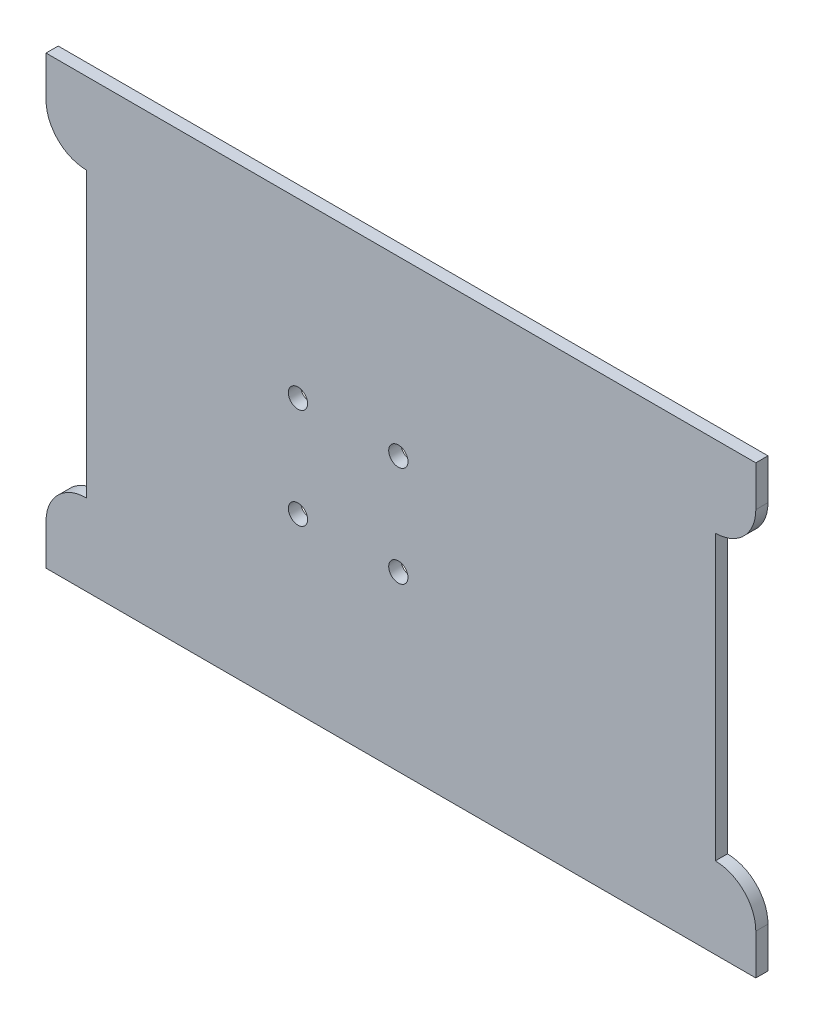
ISO-10303-21;
HEADER;
FILE_DESCRIPTION(('STEP AP214'),'2;1');
FILE_NAME('part.step','',(''),(''),'','','');
FILE_SCHEMA(('AUTOMOTIVE_DESIGN { 1 0 10303 214 1 1 1 1 }'));
ENDSEC;
DATA;
#1=APPLICATION_CONTEXT('core data for automotive mechanical design processes');
#2=APPLICATION_PROTOCOL_DEFINITION('international standard','automotive_design',2000,#1);
#3=PRODUCT_CONTEXT('',#1,'mechanical');
#4=PRODUCT('Part','Part','',(#3));
#5=PRODUCT_RELATED_PRODUCT_CATEGORY('part','',(#4));
#6=PRODUCT_DEFINITION_FORMATION('','',#4);
#7=PRODUCT_DEFINITION_CONTEXT('part definition',#1,'design');
#8=PRODUCT_DEFINITION('design','',#6,#7);
#9=PRODUCT_DEFINITION_SHAPE('','',#8);
#10=(LENGTH_UNIT() NAMED_UNIT(*) SI_UNIT(.MILLI.,.METRE.));
#11=(NAMED_UNIT(*) PLANE_ANGLE_UNIT() SI_UNIT($,.RADIAN.));
#12=(NAMED_UNIT(*) SI_UNIT($,.STERADIAN.) SOLID_ANGLE_UNIT());
#13=UNCERTAINTY_MEASURE_WITH_UNIT(LENGTH_MEASURE(1.E-05),#10,'distance_accuracy_value','');
#14=(GEOMETRIC_REPRESENTATION_CONTEXT(3) GLOBAL_UNCERTAINTY_ASSIGNED_CONTEXT((#13)) GLOBAL_UNIT_ASSIGNED_CONTEXT((#10,
#11,#12)) REPRESENTATION_CONTEXT('',''));
#15=CARTESIAN_POINT('',(0.,0.,0.));
#16=DIRECTION('',(0.,0.,1.));
#17=DIRECTION('',(1.,0.,0.));
#18=AXIS2_PLACEMENT_3D('',#15,#16,#17);
#19=CARTESIAN_POINT('',(0.,0.,-1.2));
#20=DIRECTION('',(0.,0.,1.));
#21=DIRECTION('',(1.,0.,0.));
#22=AXIS2_PLACEMENT_3D('',#19,#20,#21);
#23=PLANE('',#22);
#24=CARTESIAN_POINT('',(-10.153838394039,-4.94974746830586,-1.2));
#25=DIRECTION('',(0.,0.,1.));
#26=DIRECTION('',(1.,0.,0.));
#27=AXIS2_PLACEMENT_3D('',#24,#25,#26);
#28=CIRCLE('',#27,0.950000000000003);
#29=CARTESIAN_POINT('',(-9.20383839403895,-4.94974746830586,-1.2));
#30=VERTEX_POINT('',#29);
#31=EDGE_CURVE('E263',#30,#30,#28,.T.);
#32=ORIENTED_EDGE('',*,*,#31,.T.);
#33=EDGE_LOOP('',(#32));
#34=FACE_BOUND('',#33,.T.);
#35=CARTESIAN_POINT('',(-0.254343457427289,-4.9497474683058,-1.2));
#36=DIRECTION('',(0.,0.,1.));
#37=DIRECTION('',(1.,0.,0.));
#38=AXIS2_PLACEMENT_3D('',#35,#36,#37);
#39=CIRCLE('',#38,0.950000000000001);
#40=CARTESIAN_POINT('',(0.695656542572711,-4.9497474683058,-1.2));
#41=VERTEX_POINT('',#40);
#42=EDGE_CURVE('E257',#41,#41,#39,.T.);
#43=ORIENTED_EDGE('',*,*,#42,.T.);
#44=EDGE_LOOP('',(#43));
#45=FACE_BOUND('',#44,.T.);
#46=CARTESIAN_POINT('',(-0.254343457427348,4.94974746830586,-1.2));
#47=DIRECTION('',(0.,0.,1.));
#48=DIRECTION('',(1.,0.,0.));
#49=AXIS2_PLACEMENT_3D('',#46,#47,#48);
#50=CIRCLE('',#49,0.95);
#51=CARTESIAN_POINT('',(0.695656542572652,4.94974746830586,-1.2));
#52=VERTEX_POINT('',#51);
#53=EDGE_CURVE('E251',#52,#52,#50,.T.);
#54=ORIENTED_EDGE('',*,*,#53,.T.);
#55=EDGE_LOOP('',(#54));
#56=FACE_BOUND('',#55,.T.);
#57=CARTESIAN_POINT('',(-10.153838394039,4.9497474683058,-1.2));
#58=DIRECTION('',(0.,0.,1.));
#59=DIRECTION('',(1.,0.,0.));
#60=AXIS2_PLACEMENT_3D('',#57,#58,#59);
#61=CIRCLE('',#60,0.950000000000003);
#62=CARTESIAN_POINT('',(-9.20383839403901,4.9497474683058,-1.2));
#63=VERTEX_POINT('',#62);
#64=EDGE_CURVE('E245',#63,#63,#61,.T.);
#65=ORIENTED_EDGE('',*,*,#64,.T.);
#66=EDGE_LOOP('',(#65));
#67=FACE_BOUND('',#66,.T.);
#68=CARTESIAN_POINT('',(31.,-18.,-1.2));
#69=DIRECTION('',(0.,0.,-1.));
#70=DIRECTION('',(-1.,0.,0.));
#71=AXIS2_PLACEMENT_3D('',#68,#69,#70);
#72=CIRCLE('',#71,4.);
#73=CARTESIAN_POINT('',(31.,-14.,-1.2));
#74=VERTEX_POINT('',#73);
#75=CARTESIAN_POINT('',(35.,-18.,-1.2));
#76=VERTEX_POINT('',#75);
#77=EDGE_CURVE('E130',#74,#76,#72,.T.);
#78=ORIENTED_EDGE('',*,*,#77,.T.);
#79=DIRECTION('',(0.,1.,0.));
#80=VECTOR('',#79,1.);
#81=CARTESIAN_POINT('',(35.,-22.,-1.2));
#82=LINE('',#81,#80);
#83=CARTESIAN_POINT('',(35.,-22.,-1.2));
#84=VERTEX_POINT('',#83);
#85=EDGE_CURVE('E145',#84,#76,#82,.T.);
#86=ORIENTED_EDGE('',*,*,#85,.F.);
#87=DIRECTION('',(1.,0.,0.));
#88=VECTOR('',#87,1.);
#89=CARTESIAN_POINT('',(35.,-22.,-1.2));
#90=LINE('',#89,#88);
#91=CARTESIAN_POINT('',(-35.,-22.,-1.2));
#92=VERTEX_POINT('',#91);
#93=EDGE_CURVE('E156',#92,#84,#90,.T.);
#94=ORIENTED_EDGE('',*,*,#93,.F.);
#95=DIRECTION('',(0.,-1.,0.));
#96=VECTOR('',#95,1.);
#97=CARTESIAN_POINT('',(-35.,-22.,-1.2));
#98=LINE('',#97,#96);
#99=CARTESIAN_POINT('',(-35.,-18.,-1.2));
#100=VERTEX_POINT('',#99);
#101=EDGE_CURVE('E172',#100,#92,#98,.T.);
#102=ORIENTED_EDGE('',*,*,#101,.F.);
#103=CARTESIAN_POINT('',(-31.,-18.,-1.2));
#104=DIRECTION('',(0.,0.,-1.));
#105=DIRECTION('',(-1.,0.,0.));
#106=AXIS2_PLACEMENT_3D('',#103,#104,#105);
#107=CIRCLE('',#106,4.);
#108=CARTESIAN_POINT('',(-31.,-14.,-1.2));
#109=VERTEX_POINT('',#108);
#110=EDGE_CURVE('E199',#100,#109,#107,.T.);
#111=ORIENTED_EDGE('',*,*,#110,.T.);
#112=DIRECTION('',(0.,1.,0.));
#113=VECTOR('',#112,1.);
#114=CARTESIAN_POINT('',(-31.,0.,-1.2));
#115=LINE('',#114,#113);
#116=CARTESIAN_POINT('',(-31.,14.,-1.2));
#117=VERTEX_POINT('',#116);
#118=EDGE_CURVE('E206',#109,#117,#115,.T.);
#119=ORIENTED_EDGE('',*,*,#118,.T.);
#120=CARTESIAN_POINT('',(-31.,18.,-1.2));
#121=DIRECTION('',(0.,0.,-1.));
#122=DIRECTION('',(-1.,0.,0.));
#123=AXIS2_PLACEMENT_3D('',#120,#121,#122);
#124=CIRCLE('',#123,4.);
#125=CARTESIAN_POINT('',(-35.,18.,-1.2));
#126=VERTEX_POINT('',#125);
#127=EDGE_CURVE('E209',#117,#126,#124,.T.);
#128=ORIENTED_EDGE('',*,*,#127,.T.);
#129=CARTESIAN_POINT('',(-35.,22.,-1.2));
#130=VERTEX_POINT('',#129);
#131=EDGE_CURVE('E200',#130,#126,#98,.T.);
#132=ORIENTED_EDGE('',*,*,#131,.F.);
#133=DIRECTION('',(-1.,0.,0.));
#134=VECTOR('',#133,1.);
#135=CARTESIAN_POINT('',(35.,22.,-1.2));
#136=LINE('',#135,#134);
#137=CARTESIAN_POINT('',(35.,22.,-1.2));
#138=VERTEX_POINT('',#137);
#139=EDGE_CURVE('E151',#138,#130,#136,.T.);
#140=ORIENTED_EDGE('',*,*,#139,.F.);
#141=CARTESIAN_POINT('',(35.,18.,-1.2));
#142=VERTEX_POINT('',#141);
#143=EDGE_CURVE('E152',#142,#138,#82,.T.);
#144=ORIENTED_EDGE('',*,*,#143,.F.);
#145=CARTESIAN_POINT('',(31.,18.,-1.2));
#146=DIRECTION('',(0.,0.,-1.));
#147=DIRECTION('',(-1.,0.,0.));
#148=AXIS2_PLACEMENT_3D('',#145,#146,#147);
#149=CIRCLE('',#148,4.);
#150=CARTESIAN_POINT('',(31.,14.,-1.2));
#151=VERTEX_POINT('',#150);
#152=EDGE_CURVE('E53',#142,#151,#149,.T.);
#153=ORIENTED_EDGE('',*,*,#152,.T.);
#154=DIRECTION('',(0.,1.,0.));
#155=VECTOR('',#154,1.);
#156=CARTESIAN_POINT('',(31.,0.,-1.2));
#157=LINE('',#156,#155);
#158=EDGE_CURVE('E147',#151,#74,#157,.F.);
#159=ORIENTED_EDGE('',*,*,#158,.T.);
#160=EDGE_LOOP('',(#78,#86,#94,#102,#111,#119,#128,#132,#140,#144,#153,#159));
#161=FACE_BOUND('',#160,.T.);
#162=ADVANCED_FACE('F36',(#34,#45,#56,#67,#161),#23,.F.);
#163=CARTESIAN_POINT('',(0.,0.,0.));
#164=DIRECTION('',(0.,0.,1.));
#165=DIRECTION('',(1.,0.,0.));
#166=AXIS2_PLACEMENT_3D('',#163,#164,#165);
#167=PLANE('',#166);
#168=CARTESIAN_POINT('',(-10.153838394039,-4.94974746830586,0.));
#169=DIRECTION('',(0.,0.,1.));
#170=DIRECTION('',(1.,0.,0.));
#171=AXIS2_PLACEMENT_3D('',#168,#169,#170);
#172=CIRCLE('',#171,0.950000000000003);
#173=CARTESIAN_POINT('',(-9.20383839403895,-4.94974746830586,0.));
#174=VERTEX_POINT('',#173);
#175=EDGE_CURVE('E266',#174,#174,#172,.T.);
#176=ORIENTED_EDGE('',*,*,#175,.F.);
#177=EDGE_LOOP('',(#176));
#178=FACE_BOUND('',#177,.T.);
#179=CARTESIAN_POINT('',(-0.254343457427289,-4.9497474683058,0.));
#180=DIRECTION('',(0.,0.,1.));
#181=DIRECTION('',(1.,0.,0.));
#182=AXIS2_PLACEMENT_3D('',#179,#180,#181);
#183=CIRCLE('',#182,0.950000000000001);
#184=CARTESIAN_POINT('',(0.695656542572711,-4.9497474683058,0.));
#185=VERTEX_POINT('',#184);
#186=EDGE_CURVE('E260',#185,#185,#183,.T.);
#187=ORIENTED_EDGE('',*,*,#186,.F.);
#188=EDGE_LOOP('',(#187));
#189=FACE_BOUND('',#188,.T.);
#190=CARTESIAN_POINT('',(-0.254343457427348,4.94974746830586,0.));
#191=DIRECTION('',(0.,0.,1.));
#192=DIRECTION('',(1.,0.,0.));
#193=AXIS2_PLACEMENT_3D('',#190,#191,#192);
#194=CIRCLE('',#193,0.95);
#195=CARTESIAN_POINT('',(0.695656542572652,4.94974746830586,0.));
#196=VERTEX_POINT('',#195);
#197=EDGE_CURVE('E254',#196,#196,#194,.T.);
#198=ORIENTED_EDGE('',*,*,#197,.F.);
#199=EDGE_LOOP('',(#198));
#200=FACE_BOUND('',#199,.T.);
#201=CARTESIAN_POINT('',(-10.153838394039,4.9497474683058,0.));
#202=DIRECTION('',(0.,0.,1.));
#203=DIRECTION('',(1.,0.,0.));
#204=AXIS2_PLACEMENT_3D('',#201,#202,#203);
#205=CIRCLE('',#204,0.950000000000003);
#206=CARTESIAN_POINT('',(-9.20383839403901,4.9497474683058,0.));
#207=VERTEX_POINT('',#206);
#208=EDGE_CURVE('E248',#207,#207,#205,.T.);
#209=ORIENTED_EDGE('',*,*,#208,.F.);
#210=EDGE_LOOP('',(#209));
#211=FACE_BOUND('',#210,.T.);
#212=DIRECTION('',(0.,1.,0.));
#213=VECTOR('',#212,1.);
#214=CARTESIAN_POINT('',(35.,-22.,0.));
#215=LINE('',#214,#213);
#216=CARTESIAN_POINT('',(35.,-22.,0.));
#217=VERTEX_POINT('',#216);
#218=CARTESIAN_POINT('',(35.,-18.,0.));
#219=VERTEX_POINT('',#218);
#220=EDGE_CURVE('E168',#217,#219,#215,.T.);
#221=ORIENTED_EDGE('',*,*,#220,.T.);
#222=CARTESIAN_POINT('',(31.,-18.,0.));
#223=DIRECTION('',(0.,0.,-1.));
#224=DIRECTION('',(-1.,0.,0.));
#225=AXIS2_PLACEMENT_3D('',#222,#223,#224);
#226=CIRCLE('',#225,4.);
#227=CARTESIAN_POINT('',(31.,-14.,0.));
#228=VERTEX_POINT('',#227);
#229=EDGE_CURVE('E133',#228,#219,#226,.T.);
#230=ORIENTED_EDGE('',*,*,#229,.F.);
#231=DIRECTION('',(0.,-1.,0.));
#232=VECTOR('',#231,1.);
#233=CARTESIAN_POINT('',(31.,-14.,0.));
#234=LINE('',#233,#232);
#235=CARTESIAN_POINT('',(31.,14.,0.));
#236=VERTEX_POINT('',#235);
#237=EDGE_CURVE('E241',#236,#228,#234,.T.);
#238=ORIENTED_EDGE('',*,*,#237,.F.);
#239=CARTESIAN_POINT('',(31.,18.,0.));
#240=DIRECTION('',(0.,0.,-1.));
#241=DIRECTION('',(1.,0.,0.));
#242=AXIS2_PLACEMENT_3D('',#239,#240,#241);
#243=CIRCLE('',#242,4.);
#244=CARTESIAN_POINT('',(35.,18.,0.));
#245=VERTEX_POINT('',#244);
#246=EDGE_CURVE('E243',#245,#236,#243,.T.);
#247=ORIENTED_EDGE('',*,*,#246,.F.);
#248=CARTESIAN_POINT('',(35.,22.,0.));
#249=VERTEX_POINT('',#248);
#250=EDGE_CURVE('E167',#245,#249,#215,.T.);
#251=ORIENTED_EDGE('',*,*,#250,.T.);
#252=DIRECTION('',(-1.,0.,0.));
#253=VECTOR('',#252,1.);
#254=CARTESIAN_POINT('',(35.,22.,0.));
#255=LINE('',#254,#253);
#256=CARTESIAN_POINT('',(-35.,22.,0.));
#257=VERTEX_POINT('',#256);
#258=EDGE_CURVE('E170',#249,#257,#255,.T.);
#259=ORIENTED_EDGE('',*,*,#258,.T.);
#260=DIRECTION('',(0.,-1.,0.));
#261=VECTOR('',#260,1.);
#262=CARTESIAN_POINT('',(-35.,-22.,0.));
#263=LINE('',#262,#261);
#264=CARTESIAN_POINT('',(-35.,18.,0.));
#265=VERTEX_POINT('',#264);
#266=EDGE_CURVE('E160',#257,#265,#263,.T.);
#267=ORIENTED_EDGE('',*,*,#266,.T.);
#268=CARTESIAN_POINT('',(-31.,18.,0.));
#269=DIRECTION('',(0.,0.,-1.));
#270=DIRECTION('',(-1.,0.,0.));
#271=AXIS2_PLACEMENT_3D('',#268,#269,#270);
#272=CIRCLE('',#271,4.);
#273=CARTESIAN_POINT('',(-31.,14.,0.));
#274=VERTEX_POINT('',#273);
#275=EDGE_CURVE('E217',#274,#265,#272,.T.);
#276=ORIENTED_EDGE('',*,*,#275,.F.);
#277=DIRECTION('',(0.,1.,0.));
#278=VECTOR('',#277,1.);
#279=CARTESIAN_POINT('',(-31.,-14.,0.));
#280=LINE('',#279,#278);
#281=CARTESIAN_POINT('',(-31.,-14.,0.));
#282=VERTEX_POINT('',#281);
#283=EDGE_CURVE('E215',#282,#274,#280,.T.);
#284=ORIENTED_EDGE('',*,*,#283,.F.);
#285=CARTESIAN_POINT('',(-31.,-18.,0.));
#286=DIRECTION('',(0.,0.,-1.));
#287=DIRECTION('',(1.,0.,0.));
#288=AXIS2_PLACEMENT_3D('',#285,#286,#287);
#289=CIRCLE('',#288,4.);
#290=CARTESIAN_POINT('',(-35.,-18.,0.));
#291=VERTEX_POINT('',#290);
#292=EDGE_CURVE('E189',#291,#282,#289,.T.);
#293=ORIENTED_EDGE('',*,*,#292,.F.);
#294=CARTESIAN_POINT('',(-35.,-22.,0.));
#295=VERTEX_POINT('',#294);
#296=EDGE_CURVE('E164',#291,#295,#263,.T.);
#297=ORIENTED_EDGE('',*,*,#296,.T.);
#298=DIRECTION('',(1.,0.,0.));
#299=VECTOR('',#298,1.);
#300=CARTESIAN_POINT('',(35.,-22.,0.));
#301=LINE('',#300,#299);
#302=EDGE_CURVE('E163',#295,#217,#301,.T.);
#303=ORIENTED_EDGE('',*,*,#302,.T.);
#304=EDGE_LOOP('',(#221,#230,#238,#247,#251,#259,#267,#276,#284,#293,#297,#303));
#305=FACE_BOUND('',#304,.T.);
#306=ADVANCED_FACE('F186',(#178,#189,#200,#211,#305),#167,.T.);
#307=CARTESIAN_POINT('',(35.,-22.,-1.2));
#308=DIRECTION('',(1.,0.,0.));
#309=DIRECTION('',(0.,0.,-1.));
#310=AXIS2_PLACEMENT_3D('',#307,#308,#309);
#311=PLANE('',#310);
#312=ORIENTED_EDGE('',*,*,#250,.F.);
#313=DIRECTION('',(0.,0.,1.));
#314=VECTOR('',#313,1.);
#315=CARTESIAN_POINT('',(35.,18.,0.));
#316=LINE('',#315,#314);
#317=EDGE_CURVE('E139',#245,#142,#316,.F.);
#318=ORIENTED_EDGE('',*,*,#317,.T.);
#319=ORIENTED_EDGE('',*,*,#143,.T.);
#320=DIRECTION('',(0.,0.,1.));
#321=VECTOR('',#320,1.);
#322=CARTESIAN_POINT('',(35.,22.,-1.2));
#323=LINE('',#322,#321);
#324=EDGE_CURVE('E45',#138,#249,#323,.T.);
#325=ORIENTED_EDGE('',*,*,#324,.T.);
#326=EDGE_LOOP('',(#312,#318,#319,#325));
#327=FACE_BOUND('',#326,.T.);
#328=ADVANCED_FACE('F236',(#327),#311,.T.);
#329=CARTESIAN_POINT('',(-35.,-22.,-1.2));
#330=DIRECTION('',(-1.,0.,0.));
#331=DIRECTION('',(0.,0.,1.));
#332=AXIS2_PLACEMENT_3D('',#329,#330,#331);
#333=PLANE('',#332);
#334=ORIENTED_EDGE('',*,*,#296,.F.);
#335=DIRECTION('',(0.,0.,1.));
#336=VECTOR('',#335,1.);
#337=CARTESIAN_POINT('',(-35.,-18.,0.));
#338=LINE('',#337,#336);
#339=EDGE_CURVE('E191',#291,#100,#338,.F.);
#340=ORIENTED_EDGE('',*,*,#339,.T.);
#341=ORIENTED_EDGE('',*,*,#101,.T.);
#342=DIRECTION('',(0.,0.,1.));
#343=VECTOR('',#342,1.);
#344=CARTESIAN_POINT('',(-35.,-22.,-1.2));
#345=LINE('',#344,#343);
#346=EDGE_CURVE('E40',#92,#295,#345,.T.);
#347=ORIENTED_EDGE('',*,*,#346,.T.);
#348=EDGE_LOOP('',(#334,#340,#341,#347));
#349=FACE_BOUND('',#348,.T.);
#350=ADVANCED_FACE('F181',(#349),#333,.T.);
#351=DIRECTION('',(0.,0.,1.));
#352=VECTOR('',#351,1.);
#353=CARTESIAN_POINT('',(-35.,18.,0.));
#354=LINE('',#353,#352);
#355=EDGE_CURVE('E190',#265,#126,#354,.F.);
#356=ORIENTED_EDGE('',*,*,#355,.F.);
#357=ORIENTED_EDGE('',*,*,#266,.F.);
#358=DIRECTION('',(0.,0.,1.));
#359=VECTOR('',#358,1.);
#360=CARTESIAN_POINT('',(-35.,22.,-1.2));
#361=LINE('',#360,#359);
#362=EDGE_CURVE('E11',#130,#257,#361,.T.);
#363=ORIENTED_EDGE('',*,*,#362,.F.);
#364=ORIENTED_EDGE('',*,*,#131,.T.);
#365=EDGE_LOOP('',(#356,#357,#363,#364));
#366=FACE_BOUND('',#365,.T.);
#367=ADVANCED_FACE('F38',(#366),#333,.T.);
#368=CARTESIAN_POINT('',(35.,22.,-1.2));
#369=DIRECTION('',(0.,1.,0.));
#370=DIRECTION('',(-1.,0.,0.));
#371=AXIS2_PLACEMENT_3D('',#368,#369,#370);
#372=PLANE('',#371);
#373=ORIENTED_EDGE('',*,*,#258,.F.);
#374=ORIENTED_EDGE('',*,*,#324,.F.);
#375=ORIENTED_EDGE('',*,*,#139,.T.);
#376=ORIENTED_EDGE('',*,*,#362,.T.);
#377=EDGE_LOOP('',(#373,#374,#375,#376));
#378=FACE_BOUND('',#377,.T.);
#379=ADVANCED_FACE('F232',(#378),#372,.T.);
#380=DIRECTION('',(0.,0.,1.));
#381=VECTOR('',#380,1.);
#382=CARTESIAN_POINT('',(35.,-18.,0.));
#383=LINE('',#382,#381);
#384=EDGE_CURVE('E126',#219,#76,#383,.F.);
#385=ORIENTED_EDGE('',*,*,#384,.F.);
#386=ORIENTED_EDGE('',*,*,#220,.F.);
#387=DIRECTION('',(0.,0.,1.));
#388=VECTOR('',#387,1.);
#389=CARTESIAN_POINT('',(35.,-22.,-1.2));
#390=LINE('',#389,#388);
#391=EDGE_CURVE('E150',#84,#217,#390,.T.);
#392=ORIENTED_EDGE('',*,*,#391,.F.);
#393=ORIENTED_EDGE('',*,*,#85,.T.);
#394=EDGE_LOOP('',(#385,#386,#392,#393));
#395=FACE_BOUND('',#394,.T.);
#396=ADVANCED_FACE('F149',(#395),#311,.T.);
#397=CARTESIAN_POINT('',(35.,-22.,-1.2));
#398=DIRECTION('',(0.,-1.,0.));
#399=DIRECTION('',(1.,0.,0.));
#400=AXIS2_PLACEMENT_3D('',#397,#398,#399);
#401=PLANE('',#400);
#402=ORIENTED_EDGE('',*,*,#302,.F.);
#403=ORIENTED_EDGE('',*,*,#346,.F.);
#404=ORIENTED_EDGE('',*,*,#93,.T.);
#405=ORIENTED_EDGE('',*,*,#391,.T.);
#406=EDGE_LOOP('',(#402,#403,#404,#405));
#407=FACE_BOUND('',#406,.T.);
#408=ADVANCED_FACE('F184',(#407),#401,.T.);
#409=CARTESIAN_POINT('',(-31.,-18.,0.));
#410=DIRECTION('',(0.,0.,-1.));
#411=DIRECTION('',(-1.,0.,0.));
#412=AXIS2_PLACEMENT_3D('',#409,#410,#411);
#413=CYLINDRICAL_SURFACE('',#412,4.);
#414=ORIENTED_EDGE('',*,*,#339,.F.);
#415=ORIENTED_EDGE('',*,*,#292,.T.);
#416=DIRECTION('',(0.,0.,1.));
#417=VECTOR('',#416,1.);
#418=CARTESIAN_POINT('',(-31.,-14.,0.));
#419=LINE('',#418,#417);
#420=EDGE_CURVE('E195',#282,#109,#419,.F.);
#421=ORIENTED_EDGE('',*,*,#420,.T.);
#422=ORIENTED_EDGE('',*,*,#110,.F.);
#423=EDGE_LOOP('',(#414,#415,#421,#422));
#424=FACE_BOUND('',#423,.T.);
#425=ADVANCED_FACE('F221',(#424),#413,.T.);
#426=CARTESIAN_POINT('',(-31.,-14.,0.));
#427=DIRECTION('',(1.,0.,0.));
#428=DIRECTION('',(0.,1.,0.));
#429=AXIS2_PLACEMENT_3D('',#426,#427,#428);
#430=PLANE('',#429);
#431=ORIENTED_EDGE('',*,*,#420,.F.);
#432=ORIENTED_EDGE('',*,*,#283,.T.);
#433=DIRECTION('',(0.,0.,1.));
#434=VECTOR('',#433,1.);
#435=CARTESIAN_POINT('',(-31.,14.,0.));
#436=LINE('',#435,#434);
#437=EDGE_CURVE('E61',#274,#117,#436,.F.);
#438=ORIENTED_EDGE('',*,*,#437,.T.);
#439=ORIENTED_EDGE('',*,*,#118,.F.);
#440=EDGE_LOOP('',(#431,#432,#438,#439));
#441=FACE_BOUND('',#440,.T.);
#442=ADVANCED_FACE('F223',(#441),#430,.F.);
#443=CARTESIAN_POINT('',(-31.,18.,0.));
#444=DIRECTION('',(0.,0.,-1.));
#445=DIRECTION('',(-1.,0.,0.));
#446=AXIS2_PLACEMENT_3D('',#443,#444,#445);
#447=CYLINDRICAL_SURFACE('',#446,4.);
#448=ORIENTED_EDGE('',*,*,#275,.T.);
#449=ORIENTED_EDGE('',*,*,#355,.T.);
#450=ORIENTED_EDGE('',*,*,#127,.F.);
#451=ORIENTED_EDGE('',*,*,#437,.F.);
#452=EDGE_LOOP('',(#448,#449,#450,#451));
#453=FACE_BOUND('',#452,.T.);
#454=ADVANCED_FACE('F226',(#453),#447,.T.);
#455=CARTESIAN_POINT('',(31.,-14.,0.));
#456=DIRECTION('',(-1.,0.,0.));
#457=DIRECTION('',(0.,-1.,0.));
#458=AXIS2_PLACEMENT_3D('',#455,#456,#457);
#459=PLANE('',#458);
#460=DIRECTION('',(0.,0.,1.));
#461=VECTOR('',#460,1.);
#462=CARTESIAN_POINT('',(31.,14.,0.));
#463=LINE('',#462,#461);
#464=EDGE_CURVE('E218',#236,#151,#463,.F.);
#465=ORIENTED_EDGE('',*,*,#464,.F.);
#466=ORIENTED_EDGE('',*,*,#237,.T.);
#467=DIRECTION('',(0.,0.,1.));
#468=VECTOR('',#467,1.);
#469=CARTESIAN_POINT('',(31.,-14.,0.));
#470=LINE('',#469,#468);
#471=EDGE_CURVE('E138',#228,#74,#470,.F.);
#472=ORIENTED_EDGE('',*,*,#471,.T.);
#473=ORIENTED_EDGE('',*,*,#158,.F.);
#474=EDGE_LOOP('',(#465,#466,#472,#473));
#475=FACE_BOUND('',#474,.T.);
#476=ADVANCED_FACE('F324',(#475),#459,.F.);
#477=CARTESIAN_POINT('',(31.,-18.,0.));
#478=DIRECTION('',(0.,0.,-1.));
#479=DIRECTION('',(-1.,0.,0.));
#480=AXIS2_PLACEMENT_3D('',#477,#478,#479);
#481=CYLINDRICAL_SURFACE('',#480,4.);
#482=ORIENTED_EDGE('',*,*,#471,.F.);
#483=ORIENTED_EDGE('',*,*,#229,.T.);
#484=ORIENTED_EDGE('',*,*,#384,.T.);
#485=ORIENTED_EDGE('',*,*,#77,.F.);
#486=EDGE_LOOP('',(#482,#483,#484,#485));
#487=FACE_BOUND('',#486,.T.);
#488=ADVANCED_FACE('F129',(#487),#481,.T.);
#489=CARTESIAN_POINT('',(31.,18.,0.));
#490=DIRECTION('',(0.,0.,-1.));
#491=DIRECTION('',(-1.,0.,0.));
#492=AXIS2_PLACEMENT_3D('',#489,#490,#491);
#493=CYLINDRICAL_SURFACE('',#492,4.);
#494=ORIENTED_EDGE('',*,*,#246,.T.);
#495=ORIENTED_EDGE('',*,*,#464,.T.);
#496=ORIENTED_EDGE('',*,*,#152,.F.);
#497=ORIENTED_EDGE('',*,*,#317,.F.);
#498=EDGE_LOOP('',(#494,#495,#496,#497));
#499=FACE_BOUND('',#498,.T.);
#500=ADVANCED_FACE('F293',(#499),#493,.T.);
#501=CARTESIAN_POINT('',(-10.153838394039,4.9497474683058,-1.2));
#502=DIRECTION('',(0.,0.,1.));
#503=DIRECTION('',(1.,0.,0.));
#504=AXIS2_PLACEMENT_3D('',#501,#502,#503);
#505=CYLINDRICAL_SURFACE('',#504,0.950000000000003);
#506=ORIENTED_EDGE('',*,*,#64,.F.);
#507=EDGE_LOOP('',(#506));
#508=FACE_BOUND('',#507,.T.);
#509=ORIENTED_EDGE('',*,*,#208,.T.);
#510=EDGE_LOOP('',(#509));
#511=FACE_BOUND('',#510,.T.);
#512=ADVANCED_FACE('F290',(#508,#511),#505,.F.);
#513=CARTESIAN_POINT('',(-0.254343457427348,4.94974746830586,-1.2));
#514=DIRECTION('',(0.,0.,1.));
#515=DIRECTION('',(1.,0.,0.));
#516=AXIS2_PLACEMENT_3D('',#513,#514,#515);
#517=CYLINDRICAL_SURFACE('',#516,0.95);
#518=ORIENTED_EDGE('',*,*,#53,.F.);
#519=EDGE_LOOP('',(#518));
#520=FACE_BOUND('',#519,.T.);
#521=ORIENTED_EDGE('',*,*,#197,.T.);
#522=EDGE_LOOP('',(#521));
#523=FACE_BOUND('',#522,.T.);
#524=ADVANCED_FACE('F292',(#520,#523),#517,.F.);
#525=CARTESIAN_POINT('',(-0.254343457427289,-4.9497474683058,-1.2));
#526=DIRECTION('',(0.,0.,1.));
#527=DIRECTION('',(1.,0.,0.));
#528=AXIS2_PLACEMENT_3D('',#525,#526,#527);
#529=CYLINDRICAL_SURFACE('',#528,0.950000000000001);
#530=ORIENTED_EDGE('',*,*,#42,.F.);
#531=EDGE_LOOP('',(#530));
#532=FACE_BOUND('',#531,.T.);
#533=ORIENTED_EDGE('',*,*,#186,.T.);
#534=EDGE_LOOP('',(#533));
#535=FACE_BOUND('',#534,.T.);
#536=ADVANCED_FACE('F277',(#532,#535),#529,.F.);
#537=CARTESIAN_POINT('',(-10.153838394039,-4.94974746830586,-1.2));
#538=DIRECTION('',(0.,0.,1.));
#539=DIRECTION('',(1.,0.,0.));
#540=AXIS2_PLACEMENT_3D('',#537,#538,#539);
#541=CYLINDRICAL_SURFACE('',#540,0.950000000000003);
#542=ORIENTED_EDGE('',*,*,#31,.F.);
#543=EDGE_LOOP('',(#542));
#544=FACE_BOUND('',#543,.T.);
#545=ORIENTED_EDGE('',*,*,#175,.T.);
#546=EDGE_LOOP('',(#545));
#547=FACE_BOUND('',#546,.T.);
#548=ADVANCED_FACE('F274',(#544,#547),#541,.F.);
#549=CLOSED_SHELL('',(#162,#306,#328,#350,#367,#379,#396,#408,#425,#442,#454,#476,#488,#500,
#512,#524,#536,#548));
#550=MANIFOLD_SOLID_BREP('B2',#549);
#551=ADVANCED_BREP_SHAPE_REPRESENTATION('',(#18,#550),#14);
#552=SHAPE_DEFINITION_REPRESENTATION(#9,#551);
ENDSEC;
END-ISO-10303-21;
